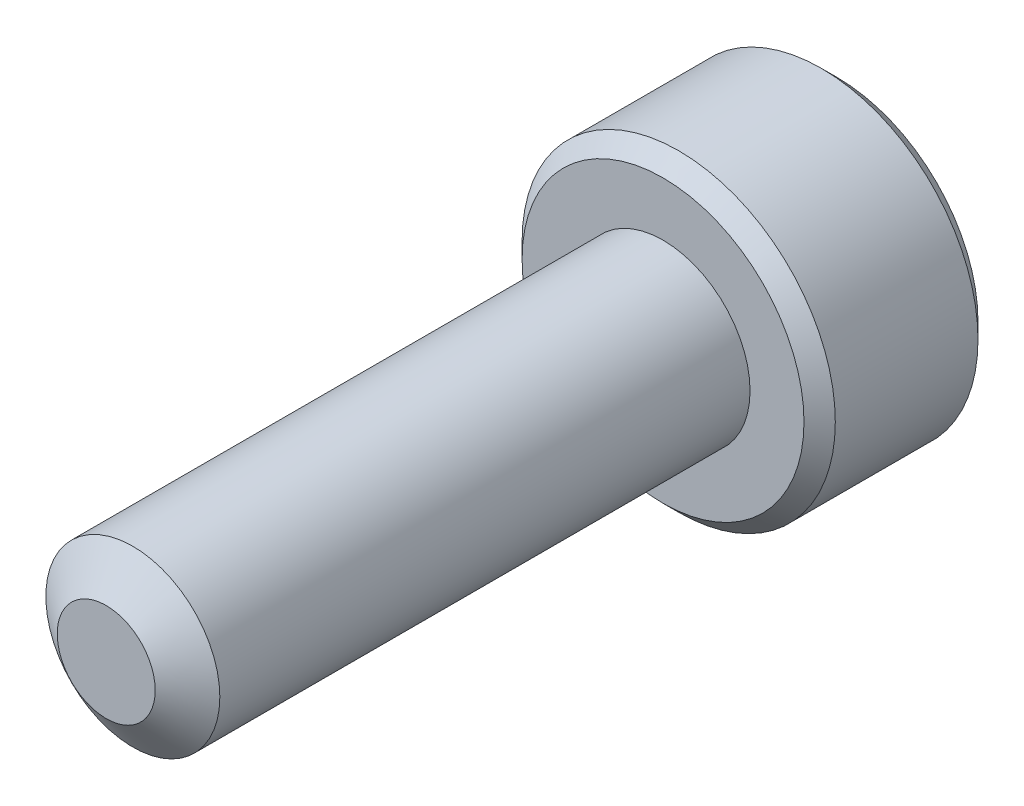
ISO-10303-21;
HEADER;
FILE_DESCRIPTION(('STEP AP214'),'2;1');
FILE_NAME('part.step','',(''),(''),'','','');
FILE_SCHEMA(('AUTOMOTIVE_DESIGN { 1 0 10303 214 1 1 1 1 }'));
ENDSEC;
DATA;
#1=APPLICATION_CONTEXT('core data for automotive mechanical design processes');
#2=APPLICATION_PROTOCOL_DEFINITION('international standard','automotive_design',2000,#1);
#3=PRODUCT_CONTEXT('',#1,'mechanical');
#4=PRODUCT('Part','Part','',(#3));
#5=PRODUCT_RELATED_PRODUCT_CATEGORY('part','',(#4));
#6=PRODUCT_DEFINITION_FORMATION('','',#4);
#7=PRODUCT_DEFINITION_CONTEXT('part definition',#1,'design');
#8=PRODUCT_DEFINITION('design','',#6,#7);
#9=PRODUCT_DEFINITION_SHAPE('','',#8);
#10=(LENGTH_UNIT() NAMED_UNIT(*) SI_UNIT(.MILLI.,.METRE.));
#11=(NAMED_UNIT(*) PLANE_ANGLE_UNIT() SI_UNIT($,.RADIAN.));
#12=(NAMED_UNIT(*) SI_UNIT($,.STERADIAN.) SOLID_ANGLE_UNIT());
#13=UNCERTAINTY_MEASURE_WITH_UNIT(LENGTH_MEASURE(1.E-05),#10,'distance_accuracy_value','');
#14=(GEOMETRIC_REPRESENTATION_CONTEXT(3) GLOBAL_UNCERTAINTY_ASSIGNED_CONTEXT((#13)) GLOBAL_UNIT_ASSIGNED_CONTEXT((#10,
#11,#12)) REPRESENTATION_CONTEXT('',''));
#15=CARTESIAN_POINT('',(0.,0.,0.));
#16=DIRECTION('',(0.,0.,1.));
#17=DIRECTION('',(1.,0.,0.));
#18=AXIS2_PLACEMENT_3D('',#15,#16,#17);
#19=CARTESIAN_POINT('',(0.,0.,-8.));
#20=DIRECTION('',(0.,0.,1.));
#21=DIRECTION('',(1.,0.,0.));
#22=AXIS2_PLACEMENT_3D('',#19,#20,#21);
#23=CYLINDRICAL_SURFACE('',#22,1.25);
#24=CARTESIAN_POINT('',(0.,0.,-8.));
#25=DIRECTION('',(0.,0.,-1.));
#26=DIRECTION('',(-1.,0.,0.));
#27=AXIS2_PLACEMENT_3D('',#24,#25,#26);
#28=CIRCLE('',#27,1.25);
#29=CARTESIAN_POINT('',(-1.25,0.,-8.));
#30=VERTEX_POINT('',#29);
#31=EDGE_CURVE('E213',#30,#30,#28,.F.);
#32=ORIENTED_EDGE('',*,*,#31,.T.);
#33=EDGE_LOOP('',(#32));
#34=FACE_BOUND('',#33,.T.);
#35=CARTESIAN_POINT('',(0.,0.,-0.382511876358969));
#36=DIRECTION('',(0.,0.,1.));
#37=DIRECTION('',(1.,0.,0.));
#38=AXIS2_PLACEMENT_3D('',#35,#36,#37);
#39=CIRCLE('',#38,1.25);
#40=CARTESIAN_POINT('',(1.25,0.,-0.382511876358969));
#41=VERTEX_POINT('',#40);
#42=EDGE_CURVE('E107',#41,#41,#39,.T.);
#43=ORIENTED_EDGE('',*,*,#42,.F.);
#44=EDGE_LOOP('',(#43));
#45=FACE_BOUND('',#44,.T.);
#46=ADVANCED_FACE('F33',(#34,#45),#23,.T.);
#47=CARTESIAN_POINT('',(0.,0.,0.));
#48=DIRECTION('',(0.,0.,-1.));
#49=DIRECTION('',(-1.,0.,0.));
#50=AXIS2_PLACEMENT_3D('',#47,#48,#49);
#51=CONICAL_SURFACE('',#50,0.703716426222746,0.959931088596886);
#52=ORIENTED_EDGE('',*,*,#42,.T.);
#53=EDGE_LOOP('',(#52));
#54=FACE_BOUND('',#53,.T.);
#55=CARTESIAN_POINT('',(0.,0.,0.));
#56=DIRECTION('',(0.,0.,1.));
#57=DIRECTION('',(1.,0.,0.));
#58=AXIS2_PLACEMENT_3D('',#55,#56,#57);
#59=CIRCLE('',#58,0.703716426222746);
#60=CARTESIAN_POINT('',(0.703716426222746,0.,0.));
#61=VERTEX_POINT('',#60);
#62=EDGE_CURVE('E211',#61,#61,#59,.T.);
#63=ORIENTED_EDGE('',*,*,#62,.F.);
#64=EDGE_LOOP('',(#63));
#65=FACE_BOUND('',#64,.T.);
#66=ADVANCED_FACE('F194',(#54,#65),#51,.T.);
#67=CARTESIAN_POINT('',(0.,0.,0.));
#68=DIRECTION('',(0.,0.,1.));
#69=DIRECTION('',(1.,0.,0.));
#70=AXIS2_PLACEMENT_3D('',#67,#68,#69);
#71=PLANE('',#70);
#72=ORIENTED_EDGE('',*,*,#62,.T.);
#73=EDGE_LOOP('',(#72));
#74=FACE_BOUND('',#73,.T.);
#75=ADVANCED_FACE('F191',(#74),#71,.T.);
#76=CARTESIAN_POINT('',(0.,0.,-10.5));
#77=DIRECTION('',(0.,0.,1.));
#78=DIRECTION('',(1.,0.,0.));
#79=AXIS2_PLACEMENT_3D('',#76,#77,#78);
#80=CYLINDRICAL_SURFACE('',#79,2.25);
#81=CARTESIAN_POINT('',(0.,0.,-10.275));
#82=DIRECTION('',(0.,0.,-1.));
#83=DIRECTION('',(-1.,0.,0.));
#84=AXIS2_PLACEMENT_3D('',#81,#82,#83);
#85=CIRCLE('',#84,2.25);
#86=CARTESIAN_POINT('',(-2.25,0.,-10.275));
#87=VERTEX_POINT('',#86);
#88=EDGE_CURVE('E41',#87,#87,#85,.F.);
#89=ORIENTED_EDGE('',*,*,#88,.T.);
#90=EDGE_LOOP('',(#89));
#91=FACE_BOUND('',#90,.T.);
#92=CARTESIAN_POINT('',(0.,0.,-8.225));
#93=DIRECTION('',(0.,0.,-1.));
#94=DIRECTION('',(-1.,0.,0.));
#95=AXIS2_PLACEMENT_3D('',#92,#93,#94);
#96=CIRCLE('',#95,2.25);
#97=CARTESIAN_POINT('',(-2.25,0.,-8.225));
#98=VERTEX_POINT('',#97);
#99=EDGE_CURVE('E170',#98,#98,#96,.T.);
#100=ORIENTED_EDGE('',*,*,#99,.T.);
#101=EDGE_LOOP('',(#100));
#102=FACE_BOUND('',#101,.T.);
#103=ADVANCED_FACE('F175',(#91,#102),#80,.T.);
#104=CARTESIAN_POINT('',(0.,0.,-10.5));
#105=DIRECTION('',(0.,0.,-1.));
#106=DIRECTION('',(-1.,0.,0.));
#107=AXIS2_PLACEMENT_3D('',#104,#105,#106);
#108=PLANE('',#107);
#109=CARTESIAN_POINT('',(0.,0.,-10.5));
#110=DIRECTION('',(0.,0.,-1.));
#111=DIRECTION('',(-1.,0.,0.));
#112=AXIS2_PLACEMENT_3D('',#109,#110,#111);
#113=CIRCLE('',#112,2.025);
#114=CARTESIAN_POINT('',(-2.025,0.,-10.5));
#115=VERTEX_POINT('',#114);
#116=EDGE_CURVE('E106',#115,#115,#113,.T.);
#117=ORIENTED_EDGE('',*,*,#116,.T.);
#118=EDGE_LOOP('',(#117));
#119=FACE_BOUND('',#118,.T.);
#120=CARTESIAN_POINT('',(0.,0.,-10.5));
#121=DIRECTION('',(0.,0.,-1.));
#122=DIRECTION('',(-1.,0.,0.));
#123=AXIS2_PLACEMENT_3D('',#120,#121,#122);
#124=CIRCLE('',#123,1.15470053837925);
#125=CARTESIAN_POINT('',(-0.999999999999994,0.577350269189638,-10.5));
#126=VERTEX_POINT('',#125);
#127=CARTESIAN_POINT('',(0.,1.15470053837925,-10.5));
#128=VERTEX_POINT('',#127);
#129=EDGE_CURVE('E87',#126,#128,#124,.T.);
#130=ORIENTED_EDGE('',*,*,#129,.F.);
#131=CARTESIAN_POINT('',(-0.999999999999994,-0.577350269189627,-10.5));
#132=VERTEX_POINT('',#131);
#133=EDGE_CURVE('E47',#132,#126,#124,.T.);
#134=ORIENTED_EDGE('',*,*,#133,.F.);
#135=CARTESIAN_POINT('',(0.,-1.15470053837925,-10.5));
#136=VERTEX_POINT('',#135);
#137=EDGE_CURVE('E272',#136,#132,#124,.T.);
#138=ORIENTED_EDGE('',*,*,#137,.F.);
#139=CARTESIAN_POINT('',(0.999999999999997,-0.577350269189633,-10.5));
#140=VERTEX_POINT('',#139);
#141=EDGE_CURVE('E54',#140,#136,#124,.T.);
#142=ORIENTED_EDGE('',*,*,#141,.F.);
#143=CARTESIAN_POINT('',(1.,0.577350269189627,-10.5));
#144=VERTEX_POINT('',#143);
#145=EDGE_CURVE('E128',#144,#140,#124,.T.);
#146=ORIENTED_EDGE('',*,*,#145,.F.);
#147=EDGE_CURVE('E96',#128,#144,#124,.T.);
#148=ORIENTED_EDGE('',*,*,#147,.F.);
#149=EDGE_LOOP('',(#130,#134,#138,#142,#146,#148));
#150=FACE_BOUND('',#149,.T.);
#151=ADVANCED_FACE('F127',(#119,#150),#108,.T.);
#152=CARTESIAN_POINT('',(0.,0.,-8.));
#153=DIRECTION('',(0.,0.,-1.));
#154=DIRECTION('',(-1.,0.,0.));
#155=AXIS2_PLACEMENT_3D('',#152,#153,#154);
#156=PLANE('',#155);
#157=CARTESIAN_POINT('',(0.,0.,-8.));
#158=DIRECTION('',(0.,0.,-1.));
#159=DIRECTION('',(-1.,0.,0.));
#160=AXIS2_PLACEMENT_3D('',#157,#158,#159);
#161=CIRCLE('',#160,2.025);
#162=CARTESIAN_POINT('',(-2.025,0.,-8.));
#163=VERTEX_POINT('',#162);
#164=EDGE_CURVE('E11',#163,#163,#161,.F.);
#165=ORIENTED_EDGE('',*,*,#164,.T.);
#166=EDGE_LOOP('',(#165));
#167=FACE_BOUND('',#166,.T.);
#168=ORIENTED_EDGE('',*,*,#31,.F.);
#169=EDGE_LOOP('',(#168));
#170=FACE_BOUND('',#169,.T.);
#171=ADVANCED_FACE('F184',(#167,#170),#156,.F.);
#172=CARTESIAN_POINT('',(0.,0.,-10.5));
#173=DIRECTION('',(0.,0.,-1.));
#174=DIRECTION('',(-1.,0.,0.));
#175=AXIS2_PLACEMENT_3D('',#172,#173,#174);
#176=CONICAL_SURFACE('',#175,1.15470053837925,0.78539816339745);
#177=ORIENTED_EDGE('',*,*,#147,.T.);
#178=CARTESIAN_POINT('',(-0.000200000000001025,1.15481600843309,-10.5001154873726));
#179=CARTESIAN_POINT('',(0.03418259500718,1.13496520795026,-10.4802779308257));
#180=CARTESIAN_POINT('',(0.0691401181398244,1.11478247255942,-10.4616050206389));
#181=CARTESIAN_POINT('',(0.140422802956089,1.07362739529219,-10.4274147427232));
#182=CARTESIAN_POINT('',(0.176754750528983,1.0526511355808,-10.4119164090235));
#183=CARTESIAN_POINT('',(0.25001661380331,1.01035337909803,-10.3853673071423));
#184=CARTESIAN_POINT('',(0.286927851445414,0.989042666109242,-10.3742497739969));
#185=CARTESIAN_POINT('',(0.361562729310859,0.945952199282692,-10.3571198657762));
#186=CARTESIAN_POINT('',(0.399284088108635,0.924173762626597,-10.3510946974667));
#187=CARTESIAN_POINT('',(0.464292198417933,0.886641312640016,-10.3456605549675));
#188=CARTESIAN_POINT('',(0.491494371528171,0.870936130672276,-10.3448569383167));
#189=CARTESIAN_POINT('',(0.545846040669112,0.839556179862849,-10.3462066994169));
#190=CARTESIAN_POINT('',(0.572995523754875,0.823881418494925,-10.3483607295472));
#191=CARTESIAN_POINT('',(0.65405627732696,0.777080970599368,-10.3591169721285));
#192=CARTESIAN_POINT('',(0.707564140978427,0.746188191116431,-10.3720145564154));
#193=CARTESIAN_POINT('',(0.801476065143431,0.691968116419651,-10.4031407306022));
#194=CARTESIAN_POINT('',(0.842320523671833,0.668386557293374,-10.4197377977018));
#195=CARTESIAN_POINT('',(0.922409637381941,0.622147085933684,-10.4571249246853));
#196=CARTESIAN_POINT('',(0.961659010870435,0.599486449584578,-10.4779013418174));
#197=CARTESIAN_POINT('',(1.0002,0.577234799135791,-10.5001154873726));
#198=B_SPLINE_CURVE_WITH_KNOTS('',3,(#178,#179,#180,#181,#182,#183,#184,#185,#186,#187,#188,
#189,#190,#191,#192,#193,#194,#195,#196,#197),.UNSPECIFIED.,.F.,.F.,(4,2,2,2,2,2,2,2,2,4),(0.,
0.13323767682856,0.26725222983449,0.3991370762693,0.530689603280768,0.624814864263846,
0.718960890149133,0.907306626112098,1.05710100361789,1.20641411519286),.UNSPECIFIED.);
#199=EDGE_CURVE('E101',#128,#144,#198,.T.);
#200=ORIENTED_EDGE('',*,*,#199,.F.);
#201=EDGE_LOOP('',(#177,#200));
#202=FACE_BOUND('',#201,.T.);
#203=ADVANCED_FACE('F102',(#202),#176,.F.);
#204=ORIENTED_EDGE('',*,*,#145,.T.);
#205=CARTESIAN_POINT('',(0.999999999999997,-1.15147208646461,-10.8703856775139));
#206=CARTESIAN_POINT('',(0.999999999999997,-1.12343447988552,-10.8492199198737));
#207=CARTESIAN_POINT('',(0.999999999999997,-1.09524064850697,-10.8282616921759));
#208=CARTESIAN_POINT('',(0.999999999999997,-1.03847715644376,-10.7868460222356));
#209=CARTESIAN_POINT('',(0.999999999999997,-1.00990740382975,-10.7663887061237));
#210=CARTESIAN_POINT('',(0.999999999999997,-0.923120894333475,-10.7056047949545));
#211=CARTESIAN_POINT('',(0.999999999999997,-0.864253173759058,-10.6661922289614));
#212=CARTESIAN_POINT('',(0.999999999999997,-0.740809858258044,-10.5888206642002));
#213=CARTESIAN_POINT('',(0.999999999999997,-0.676100255137806,-10.5510730391143));
#214=CARTESIAN_POINT('',(0.999999999999997,-0.543448939049123,-10.4820245875513));
#215=CARTESIAN_POINT('',(0.999999999999997,-0.475519112027778,-10.4507020278469));
#216=CARTESIAN_POINT('',(0.999999999999997,-0.373555850333528,-10.4123817788838));
#217=CARTESIAN_POINT('',(0.999999999999997,-0.341031989670907,-10.4013835916422));
#218=CARTESIAN_POINT('',(0.999999999999997,-0.275199079052293,-10.3819983421474));
#219=CARTESIAN_POINT('',(0.999999999999997,-0.241889975173933,-10.3736114597767));
#220=CARTESIAN_POINT('',(0.999999999999997,-0.175247517042993,-10.360025220719));
#221=CARTESIAN_POINT('',(0.999999999999997,-0.141925568218175,-10.354770790768));
#222=CARTESIAN_POINT('',(0.999999999999997,-0.0749144362322791,-10.3475486865709));
#223=CARTESIAN_POINT('',(0.999999999999997,-0.0412251978501621,-10.3455815136105));
#224=CARTESIAN_POINT('',(0.999999999999997,0.0249580992634205,-10.3450831983932));
#225=CARTESIAN_POINT('',(0.999999999999997,0.0574512826460387,-10.3464302678886));
#226=CARTESIAN_POINT('',(0.999999999999997,0.122148505701866,-10.352216484499));
#227=CARTESIAN_POINT('',(0.999999999999997,0.154352610132926,-10.3566549206615));
#228=CARTESIAN_POINT('',(0.999999999999997,0.218799898867639,-10.3684568301452));
#229=CARTESIAN_POINT('',(0.999999999999997,0.251033743268952,-10.3758705410385));
#230=CARTESIAN_POINT('',(0.999999999999997,0.314797132354918,-10.3932289424987));
#231=CARTESIAN_POINT('',(0.999999999999997,0.346326735731003,-10.4031734212888));
#232=CARTESIAN_POINT('',(0.999999999999997,0.445594187730203,-10.4382234825543));
#233=CARTESIAN_POINT('',(0.999999999999997,0.511919139476034,-10.4673208583567));
#234=CARTESIAN_POINT('',(0.999999999999997,0.64145324465753,-10.5320153296865));
#235=CARTESIAN_POINT('',(0.999999999999997,0.704650133126342,-10.5676357767152));
#236=CARTESIAN_POINT('',(0.999999999999997,0.825428490174984,-10.6411239013469));
#237=CARTESIAN_POINT('',(0.999999999999997,0.883132947867681,-10.6787919471355));
#238=CARTESIAN_POINT('',(0.999999999999997,0.968148853704561,-10.7370228529432));
#239=CARTESIAN_POINT('',(0.999999999999997,0.996120570380281,-10.7566384757629));
#240=CARTESIAN_POINT('',(0.999999999999997,1.05168177729901,-10.7963885170613));
#241=CARTESIAN_POINT('',(0.999999999999997,1.079271369977,-10.8165227921988));
#242=CARTESIAN_POINT('',(0.999999999999997,1.10670185346329,-10.836872119073));
#243=B_SPLINE_CURVE_WITH_KNOTS('',3,(#205,#206,#207,#208,#209,#210,#211,#212,#213,#214,#215,
#216,#217,#218,#219,#220,#221,#222,#223,#224,#225,#226,#227,#228,#229,#230,#231,#232,#233,#234,
#235,#236,#237,#238,#239,#240,#241,#242),.UNSPECIFIED.,.F.,.F.,(4,2,2,2,2,2,2,2,2,2,2,2,2,2,2,2,
2,2,4),(0.,0.10538645908329,0.210799187330123,0.423233611565467,0.647793540908501,
0.871580877738607,0.974493074181417,1.07741235827201,1.17846428203204,1.27953161415762,
1.3769408673961,1.47432772585407,1.57343322804293,1.67253043972851,1.88917353996827,
2.10660791038812,2.31323734249842,2.41572589232044,2.51818641476502),.UNSPECIFIED.);
#244=EDGE_CURVE('E95',#144,#140,#243,.F.);
#245=ORIENTED_EDGE('',*,*,#244,.F.);
#246=EDGE_LOOP('',(#204,#245));
#247=FACE_BOUND('',#246,.T.);
#248=ADVANCED_FACE('F278',(#247),#176,.F.);
#249=ORIENTED_EDGE('',*,*,#141,.T.);
#250=CARTESIAN_POINT('',(1.0002,-0.577234799135786,-10.5001154873726));
#251=CARTESIAN_POINT('',(0.965817404992817,-0.59708559961862,-10.4802779308257));
#252=CARTESIAN_POINT('',(0.930859881860172,-0.617268335009454,-10.4616050206389));
#253=CARTESIAN_POINT('',(0.859577197043908,-0.658423412276684,-10.4274147427232));
#254=CARTESIAN_POINT('',(0.823245249471014,-0.679399671988078,-10.4119164090235));
#255=CARTESIAN_POINT('',(0.749983386196687,-0.721697428470844,-10.3853673071423));
#256=CARTESIAN_POINT('',(0.713072148554584,-0.743008141459634,-10.3742497739969));
#257=CARTESIAN_POINT('',(0.638437270689139,-0.786098608286184,-10.3571198657762));
#258=CARTESIAN_POINT('',(0.600715911891363,-0.807877044942279,-10.3510946974667));
#259=CARTESIAN_POINT('',(0.535707801582065,-0.84540949492886,-10.3456605549675));
#260=CARTESIAN_POINT('',(0.508505628471827,-0.861114676896599,-10.3448569383167));
#261=CARTESIAN_POINT('',(0.454153959330887,-0.892494627706026,-10.3462066994169));
#262=CARTESIAN_POINT('',(0.427004476245123,-0.908169389073951,-10.3483607295472));
#263=CARTESIAN_POINT('',(0.345943722673039,-0.954969836969508,-10.3591169721285));
#264=CARTESIAN_POINT('',(0.292435859021572,-0.985862616452445,-10.3720145564154));
#265=CARTESIAN_POINT('',(0.198523934856569,-1.04008269114923,-10.4031407306022));
#266=CARTESIAN_POINT('',(0.157679476328166,-1.0636642502755,-10.4197377977018));
#267=CARTESIAN_POINT('',(0.0775903626180567,-1.10990372163519,-10.4571249246853));
#268=CARTESIAN_POINT('',(0.0383409891295626,-1.1325643579843,-10.4779013418174));
#269=CARTESIAN_POINT('',(-0.00019999999999984,-1.15481600843309,-10.5001154873726));
#270=B_SPLINE_CURVE_WITH_KNOTS('',3,(#250,#251,#252,#253,#254,#255,#256,#257,#258,#259,#260,
#261,#262,#263,#264,#265,#266,#267,#268,#269),.UNSPECIFIED.,.F.,.F.,(4,2,2,2,2,2,2,2,2,4),(0.,
0.133237676828559,0.267252229834489,0.399137076269299,0.530689603280767,0.624814864263844,
0.718960890149131,0.907306626112095,1.05710100361789,1.20641411519286),.UNSPECIFIED.);
#271=EDGE_CURVE('E138',#140,#136,#270,.T.);
#272=ORIENTED_EDGE('',*,*,#271,.F.);
#273=EDGE_LOOP('',(#249,#272));
#274=FACE_BOUND('',#273,.T.);
#275=ADVANCED_FACE('F275',(#274),#176,.F.);
#276=ORIENTED_EDGE('',*,*,#137,.T.);
#277=CARTESIAN_POINT('',(0.000199999999999672,-1.15481600843309,-10.5001154873726));
#278=CARTESIAN_POINT('',(-0.0341825950071813,-1.13496520795025,-10.4802779308257));
#279=CARTESIAN_POINT('',(-0.0691401181398256,-1.11478247255942,-10.4616050206389));
#280=CARTESIAN_POINT('',(-0.14042280295609,-1.07362739529219,-10.4274147427232));
#281=CARTESIAN_POINT('',(-0.176754750528984,-1.0526511355808,-10.4119164090235));
#282=CARTESIAN_POINT('',(-0.250016613803311,-1.01035337909803,-10.3853673071423));
#283=CARTESIAN_POINT('',(-0.286927851445414,-0.989042666109238,-10.3742497739969));
#284=CARTESIAN_POINT('',(-0.361562729310859,-0.945952199282689,-10.3571198657762));
#285=CARTESIAN_POINT('',(-0.399284088108635,-0.924173762626594,-10.3510946974667));
#286=CARTESIAN_POINT('',(-0.464292198417933,-0.886641312640013,-10.3456605549675));
#287=CARTESIAN_POINT('',(-0.491494371528171,-0.870936130672274,-10.3448569383167));
#288=CARTESIAN_POINT('',(-0.545846040669111,-0.839556179862846,-10.3462066994169));
#289=CARTESIAN_POINT('',(-0.572995523754874,-0.823881418494922,-10.3483607295472));
#290=CARTESIAN_POINT('',(-0.654056277326959,-0.777080970599365,-10.3591169721285));
#291=CARTESIAN_POINT('',(-0.707564140978426,-0.746188191116429,-10.3720145564154));
#292=CARTESIAN_POINT('',(-0.801476065143429,-0.691968116419649,-10.4031407306022));
#293=CARTESIAN_POINT('',(-0.842320523671831,-0.668386557293371,-10.4197377977018));
#294=CARTESIAN_POINT('',(-0.922409637381938,-0.622147085933682,-10.4571249246853));
#295=CARTESIAN_POINT('',(-0.961659010870432,-0.599486449584576,-10.4779013418174));
#296=CARTESIAN_POINT('',(-1.00019999999999,-0.577234799135789,-10.5001154873726));
#297=B_SPLINE_CURVE_WITH_KNOTS('',3,(#277,#278,#279,#280,#281,#282,#283,#284,#285,#286,#287,
#288,#289,#290,#291,#292,#293,#294,#295,#296),.UNSPECIFIED.,.F.,.F.,(4,2,2,2,2,2,2,2,2,4),(0.,
0.133237676828559,0.267252229834489,0.399137076269299,0.530689603280767,0.624814864263844,
0.718960890149131,0.907306626112095,1.05710100361789,1.20641411519285),.UNSPECIFIED.);
#298=EDGE_CURVE('E249',#136,#132,#297,.T.);
#299=ORIENTED_EDGE('',*,*,#298,.F.);
#300=EDGE_LOOP('',(#276,#299));
#301=FACE_BOUND('',#300,.T.);
#302=ADVANCED_FACE('F274',(#301),#176,.F.);
#303=ORIENTED_EDGE('',*,*,#133,.T.);
#304=CARTESIAN_POINT('',(-0.999999999999994,-1.15147208646462,-10.8703856775139));
#305=CARTESIAN_POINT('',(-0.999999999999994,-1.12343447988552,-10.8492199198737));
#306=CARTESIAN_POINT('',(-0.999999999999994,-1.09524064850698,-10.8282616921759));
#307=CARTESIAN_POINT('',(-0.999999999999994,-1.03847715644377,-10.7868460222356));
#308=CARTESIAN_POINT('',(-0.999999999999994,-1.00990740382975,-10.7663887061237));
#309=CARTESIAN_POINT('',(-0.999999999999994,-0.923120894333481,-10.7056047949545));
#310=CARTESIAN_POINT('',(-0.999999999999994,-0.864253173759064,-10.6661922289614));
#311=CARTESIAN_POINT('',(-0.999999999999994,-0.74080985825805,-10.5888206642002));
#312=CARTESIAN_POINT('',(-0.999999999999994,-0.676100255137811,-10.5510730391143));
#313=CARTESIAN_POINT('',(-0.999999999999994,-0.543448939049128,-10.4820245875513));
#314=CARTESIAN_POINT('',(-0.999999999999994,-0.475519112027782,-10.4507020278469));
#315=CARTESIAN_POINT('',(-0.999999999999994,-0.373555850333532,-10.4123817788838));
#316=CARTESIAN_POINT('',(-0.999999999999994,-0.341031989670911,-10.4013835916422));
#317=CARTESIAN_POINT('',(-0.999999999999994,-0.275199079052297,-10.3819983421474));
#318=CARTESIAN_POINT('',(-0.999999999999994,-0.241889975173936,-10.3736114597767));
#319=CARTESIAN_POINT('',(-0.999999999999994,-0.175247517042995,-10.360025220719));
#320=CARTESIAN_POINT('',(-0.999999999999994,-0.141925568218178,-10.354770790768));
#321=CARTESIAN_POINT('',(-0.999999999999994,-0.0749144362322814,-10.3475486865709));
#322=CARTESIAN_POINT('',(-0.999999999999994,-0.0412251978501641,-10.3455815136105));
#323=CARTESIAN_POINT('',(-0.999999999999994,0.0249580992634187,-10.3450831983932));
#324=CARTESIAN_POINT('',(-0.999999999999994,0.0574512826460369,-10.3464302678886));
#325=CARTESIAN_POINT('',(-0.999999999999994,0.122148505701864,-10.352216484499));
#326=CARTESIAN_POINT('',(-0.999999999999994,0.154352610132924,-10.3566549206615));
#327=CARTESIAN_POINT('',(-0.999999999999994,0.218799898867637,-10.3684568301452));
#328=CARTESIAN_POINT('',(-0.999999999999994,0.251033743268951,-10.3758705410385));
#329=CARTESIAN_POINT('',(-0.999999999999994,0.314797132354916,-10.3932289424987));
#330=CARTESIAN_POINT('',(-0.999999999999994,0.346326735731002,-10.4031734212888));
#331=CARTESIAN_POINT('',(-0.999999999999994,0.445594187730202,-10.4382234825543));
#332=CARTESIAN_POINT('',(-0.999999999999994,0.511919139476034,-10.4673208583567));
#333=CARTESIAN_POINT('',(-0.999999999999994,0.641453244657529,-10.5320153296865));
#334=CARTESIAN_POINT('',(-0.999999999999994,0.70465013312634,-10.5676357767152));
#335=CARTESIAN_POINT('',(-0.999999999999994,0.825428490174982,-10.6411239013469));
#336=CARTESIAN_POINT('',(-0.999999999999994,0.883132947867679,-10.6787919471355));
#337=CARTESIAN_POINT('',(-0.999999999999994,0.968148853704559,-10.7370228529432));
#338=CARTESIAN_POINT('',(-0.999999999999994,0.996120570380279,-10.7566384757628));
#339=CARTESIAN_POINT('',(-0.999999999999994,1.05168177729901,-10.7963885170613));
#340=CARTESIAN_POINT('',(-0.999999999999994,1.079271369977,-10.8165227921988));
#341=CARTESIAN_POINT('',(-0.999999999999994,1.10670185346329,-10.836872119073));
#342=B_SPLINE_CURVE_WITH_KNOTS('',3,(#304,#305,#306,#307,#308,#309,#310,#311,#312,#313,#314,
#315,#316,#317,#318,#319,#320,#321,#322,#323,#324,#325,#326,#327,#328,#329,#330,#331,#332,#333,
#334,#335,#336,#337,#338,#339,#340,#341),.UNSPECIFIED.,.F.,.F.,(4,2,2,2,2,2,2,2,2,2,2,2,2,2,2,2,
2,2,4),(0.,0.10538645908329,0.210799187330124,0.423233611565468,0.647793540908503,
0.871580877738611,0.974493074181422,1.07741235827201,1.17846428203205,1.27953161415762,
1.37694086739611,1.47432772585408,1.57343322804293,1.67253043972852,1.88917353996827,
2.10660791038813,2.31323734249843,2.41572589232044,2.51818641476503),.UNSPECIFIED.);
#343=EDGE_CURVE('E117',#132,#126,#342,.T.);
#344=ORIENTED_EDGE('',*,*,#343,.F.);
#345=EDGE_LOOP('',(#303,#344));
#346=FACE_BOUND('',#345,.T.);
#347=ADVANCED_FACE('F287',(#346),#176,.F.);
#348=ORIENTED_EDGE('',*,*,#129,.T.);
#349=CARTESIAN_POINT('',(-1.00019999999999,0.577234799135794,-10.5001154873726));
#350=CARTESIAN_POINT('',(-0.965817404992813,0.597085599618627,-10.4802779308257));
#351=CARTESIAN_POINT('',(-0.93085988186017,0.617268335009462,-10.4616050206389));
#352=CARTESIAN_POINT('',(-0.859577197043906,0.658423412276691,-10.4274147427232));
#353=CARTESIAN_POINT('',(-0.823245249471012,0.679399671988084,-10.4119164090235));
#354=CARTESIAN_POINT('',(-0.749983386196686,0.72169742847085,-10.3853673071423));
#355=CARTESIAN_POINT('',(-0.713072148554583,0.74300814145964,-10.3742497739969));
#356=CARTESIAN_POINT('',(-0.638437270689139,0.786098608286189,-10.3571198657762));
#357=CARTESIAN_POINT('',(-0.600715911891363,0.807877044942284,-10.3510946974667));
#358=CARTESIAN_POINT('',(-0.535707801582065,0.845409494928865,-10.3456605549675));
#359=CARTESIAN_POINT('',(-0.508505628471827,0.861114676896604,-10.3448569383167));
#360=CARTESIAN_POINT('',(-0.454153959330887,0.892494627706032,-10.3462066994169));
#361=CARTESIAN_POINT('',(-0.427004476245123,0.908169389073956,-10.3483607295472));
#362=CARTESIAN_POINT('',(-0.345943722673038,0.954969836969513,-10.3591169721285));
#363=CARTESIAN_POINT('',(-0.292435859021571,0.98586261645245,-10.3720145564154));
#364=CARTESIAN_POINT('',(-0.198523934856568,1.04008269114923,-10.4031407306022));
#365=CARTESIAN_POINT('',(-0.157679476328166,1.06366425027551,-10.4197377977018));
#366=CARTESIAN_POINT('',(-0.0775903626180574,1.1099037216352,-10.4571249246853));
#367=CARTESIAN_POINT('',(-0.0383409891295638,1.1325643579843,-10.4779013418174));
#368=CARTESIAN_POINT('',(0.000199999999998055,1.15481600843309,-10.5001154873726));
#369=B_SPLINE_CURVE_WITH_KNOTS('',3,(#349,#350,#351,#352,#353,#354,#355,#356,#357,#358,#359,
#360,#361,#362,#363,#364,#365,#366,#367,#368),.UNSPECIFIED.,.F.,.F.,(4,2,2,2,2,2,2,2,2,4),(0.,
0.133237676828557,0.267252229834486,0.399137076269294,0.530689603280761,0.624814864263839,
0.718960890149126,0.90730662611209,1.05710100361788,1.20641411519285),.UNSPECIFIED.);
#370=EDGE_CURVE('E91',#126,#128,#369,.T.);
#371=ORIENTED_EDGE('',*,*,#370,.F.);
#372=EDGE_LOOP('',(#348,#371));
#373=FACE_BOUND('',#372,.T.);
#374=ADVANCED_FACE('F89',(#373),#176,.F.);
#375=CARTESIAN_POINT('',(0.999999999999997,1.73205080756888,-9.));
#376=DIRECTION('',(0.,0.,-1.));
#377=DIRECTION('',(-1.,0.,0.));
#378=AXIS2_PLACEMENT_3D('',#375,#376,#377);
#379=PLANE('',#378);
#380=DIRECTION('',(0.866025403784439,0.5,0.));
#381=VECTOR('',#380,1.);
#382=CARTESIAN_POINT('',(-0.999999999999994,0.577350269189631,-9.));
#383=LINE('',#382,#381);
#384=CARTESIAN_POINT('',(-0.999999999999994,0.577350269189631,-9.));
#385=VERTEX_POINT('',#384);
#386=CARTESIAN_POINT('',(0.,1.15470053837925,-9.));
#387=VERTEX_POINT('',#386);
#388=EDGE_CURVE('E116',#385,#387,#383,.T.);
#389=ORIENTED_EDGE('',*,*,#388,.T.);
#390=DIRECTION('',(0.866025403784439,-0.499999999999999,0.));
#391=VECTOR('',#390,1.);
#392=CARTESIAN_POINT('',(0.,1.15470053837925,-9.));
#393=LINE('',#392,#391);
#394=CARTESIAN_POINT('',(0.999999999999997,0.577350269189629,-9.));
#395=VERTEX_POINT('',#394);
#396=EDGE_CURVE('E121',#387,#395,#393,.T.);
#397=ORIENTED_EDGE('',*,*,#396,.T.);
#398=DIRECTION('',(0.,-1.,0.));
#399=VECTOR('',#398,1.);
#400=CARTESIAN_POINT('',(0.999999999999997,0.577350269189629,-9.));
#401=LINE('',#400,#399);
#402=CARTESIAN_POINT('',(0.999999999999997,-0.577350269189624,-9.));
#403=VERTEX_POINT('',#402);
#404=EDGE_CURVE('E235',#395,#403,#401,.T.);
#405=ORIENTED_EDGE('',*,*,#404,.T.);
#406=DIRECTION('',(-0.866025403784438,-0.500000000000001,0.));
#407=VECTOR('',#406,1.);
#408=CARTESIAN_POINT('',(0.999999999999997,-0.577350269189624,-9.));
#409=LINE('',#408,#407);
#410=CARTESIAN_POINT('',(0.,-1.15470053837925,-9.));
#411=VERTEX_POINT('',#410);
#412=EDGE_CURVE('E232',#403,#411,#409,.T.);
#413=ORIENTED_EDGE('',*,*,#412,.T.);
#414=DIRECTION('',(-0.866025403784439,0.5,0.));
#415=VECTOR('',#414,1.);
#416=CARTESIAN_POINT('',(0.,-1.15470053837925,-9.));
#417=LINE('',#416,#415);
#418=CARTESIAN_POINT('',(-0.999999999999994,-0.577350269189627,-9.));
#419=VERTEX_POINT('',#418);
#420=EDGE_CURVE('E229',#411,#419,#417,.T.);
#421=ORIENTED_EDGE('',*,*,#420,.T.);
#422=DIRECTION('',(0.,1.,0.));
#423=VECTOR('',#422,1.);
#424=CARTESIAN_POINT('',(-0.999999999999994,-0.577350269189627,-9.));
#425=LINE('',#424,#423);
#426=EDGE_CURVE('E124',#419,#385,#425,.T.);
#427=ORIENTED_EDGE('',*,*,#426,.T.);
#428=EDGE_LOOP('',(#389,#397,#405,#413,#421,#427));
#429=FACE_BOUND('',#428,.T.);
#430=ADVANCED_FACE('F158',(#429),#379,.T.);
#431=CARTESIAN_POINT('',(0.,1.15470053837925,-9.));
#432=DIRECTION('',(0.499999999999999,0.866025403784439,0.));
#433=DIRECTION('',(-0.866025403784439,0.499999999999999,0.));
#434=AXIS2_PLACEMENT_3D('',#431,#432,#433);
#435=PLANE('',#434);
#436=DIRECTION('',(0.,0.,-1.));
#437=VECTOR('',#436,1.);
#438=CARTESIAN_POINT('',(0.,1.15470053837925,-9.));
#439=LINE('',#438,#437);
#440=EDGE_CURVE('E113',#387,#128,#439,.T.);
#441=ORIENTED_EDGE('',*,*,#440,.T.);
#442=ORIENTED_EDGE('',*,*,#199,.T.);
#443=DIRECTION('',(0.,0.,-1.));
#444=VECTOR('',#443,1.);
#445=CARTESIAN_POINT('',(0.999999999999997,0.577350269189629,-9.));
#446=LINE('',#445,#444);
#447=EDGE_CURVE('E123',#395,#144,#446,.T.);
#448=ORIENTED_EDGE('',*,*,#447,.F.);
#449=ORIENTED_EDGE('',*,*,#396,.F.);
#450=EDGE_LOOP('',(#441,#442,#448,#449));
#451=FACE_BOUND('',#450,.T.);
#452=ADVANCED_FACE('F119',(#451),#435,.F.);
#453=CARTESIAN_POINT('',(0.999999999999997,0.577350269189629,-9.));
#454=DIRECTION('',(1.,0.,0.));
#455=DIRECTION('',(0.,0.,-1.));
#456=AXIS2_PLACEMENT_3D('',#453,#454,#455);
#457=PLANE('',#456);
#458=ORIENTED_EDGE('',*,*,#447,.T.);
#459=ORIENTED_EDGE('',*,*,#244,.T.);
#460=DIRECTION('',(0.,0.,-1.));
#461=VECTOR('',#460,1.);
#462=CARTESIAN_POINT('',(0.999999999999997,-0.577350269189624,-9.));
#463=LINE('',#462,#461);
#464=EDGE_CURVE('E218',#403,#140,#463,.T.);
#465=ORIENTED_EDGE('',*,*,#464,.F.);
#466=ORIENTED_EDGE('',*,*,#404,.F.);
#467=EDGE_LOOP('',(#458,#459,#465,#466));
#468=FACE_BOUND('',#467,.T.);
#469=ADVANCED_FACE('F147',(#468),#457,.F.);
#470=CARTESIAN_POINT('',(0.999999999999997,-0.577350269189624,-9.));
#471=DIRECTION('',(0.500000000000001,-0.866025403784438,0.));
#472=DIRECTION('',(0.866025403784438,0.500000000000001,0.));
#473=AXIS2_PLACEMENT_3D('',#470,#471,#472);
#474=PLANE('',#473);
#475=ORIENTED_EDGE('',*,*,#464,.T.);
#476=ORIENTED_EDGE('',*,*,#271,.T.);
#477=DIRECTION('',(0.,0.,-1.));
#478=VECTOR('',#477,1.);
#479=CARTESIAN_POINT('',(0.,-1.15470053837925,-9.));
#480=LINE('',#479,#478);
#481=EDGE_CURVE('E221',#411,#136,#480,.T.);
#482=ORIENTED_EDGE('',*,*,#481,.F.);
#483=ORIENTED_EDGE('',*,*,#412,.F.);
#484=EDGE_LOOP('',(#475,#476,#482,#483));
#485=FACE_BOUND('',#484,.T.);
#486=ADVANCED_FACE('F151',(#485),#474,.F.);
#487=CARTESIAN_POINT('',(0.,-1.15470053837925,-9.));
#488=DIRECTION('',(-0.5,-0.866025403784439,0.));
#489=DIRECTION('',(0.866025403784439,-0.5,0.));
#490=AXIS2_PLACEMENT_3D('',#487,#488,#489);
#491=PLANE('',#490);
#492=ORIENTED_EDGE('',*,*,#481,.T.);
#493=ORIENTED_EDGE('',*,*,#298,.T.);
#494=DIRECTION('',(0.,0.,-1.));
#495=VECTOR('',#494,1.);
#496=CARTESIAN_POINT('',(-0.999999999999994,-0.577350269189627,-9.));
#497=LINE('',#496,#495);
#498=EDGE_CURVE('E224',#419,#132,#497,.T.);
#499=ORIENTED_EDGE('',*,*,#498,.F.);
#500=ORIENTED_EDGE('',*,*,#420,.F.);
#501=EDGE_LOOP('',(#492,#493,#499,#500));
#502=FACE_BOUND('',#501,.T.);
#503=ADVANCED_FACE('F257',(#502),#491,.F.);
#504=CARTESIAN_POINT('',(-0.999999999999994,-0.577350269189627,-9.));
#505=DIRECTION('',(-1.,0.,0.));
#506=DIRECTION('',(0.,0.,1.));
#507=AXIS2_PLACEMENT_3D('',#504,#505,#506);
#508=PLANE('',#507);
#509=ORIENTED_EDGE('',*,*,#498,.T.);
#510=ORIENTED_EDGE('',*,*,#343,.T.);
#511=DIRECTION('',(0.,0.,-1.));
#512=VECTOR('',#511,1.);
#513=CARTESIAN_POINT('',(-0.999999999999994,0.577350269189631,-9.));
#514=LINE('',#513,#512);
#515=EDGE_CURVE('E115',#385,#126,#514,.T.);
#516=ORIENTED_EDGE('',*,*,#515,.F.);
#517=ORIENTED_EDGE('',*,*,#426,.F.);
#518=EDGE_LOOP('',(#509,#510,#516,#517));
#519=FACE_BOUND('',#518,.T.);
#520=ADVANCED_FACE('F254',(#519),#508,.F.);
#521=CARTESIAN_POINT('',(-0.999999999999994,0.577350269189631,-9.));
#522=DIRECTION('',(-0.5,0.866025403784439,0.));
#523=DIRECTION('',(-0.866025403784439,-0.5,0.));
#524=AXIS2_PLACEMENT_3D('',#521,#522,#523);
#525=PLANE('',#524);
#526=ORIENTED_EDGE('',*,*,#515,.T.);
#527=ORIENTED_EDGE('',*,*,#370,.T.);
#528=ORIENTED_EDGE('',*,*,#440,.F.);
#529=ORIENTED_EDGE('',*,*,#388,.F.);
#530=EDGE_LOOP('',(#526,#527,#528,#529));
#531=FACE_BOUND('',#530,.T.);
#532=ADVANCED_FACE('F111',(#531),#525,.F.);
#533=CARTESIAN_POINT('',(0.,0.,-10.5));
#534=DIRECTION('',(0.,0.,1.));
#535=DIRECTION('',(1.,0.,0.));
#536=AXIS2_PLACEMENT_3D('',#533,#534,#535);
#537=CONICAL_SURFACE('',#536,2.025,0.785398163397448);
#538=ORIENTED_EDGE('',*,*,#88,.F.);
#539=EDGE_LOOP('',(#538));
#540=FACE_BOUND('',#539,.T.);
#541=ORIENTED_EDGE('',*,*,#116,.F.);
#542=EDGE_LOOP('',(#541));
#543=FACE_BOUND('',#542,.T.);
#544=ADVANCED_FACE('F178',(#540,#543),#537,.T.);
#545=CARTESIAN_POINT('',(0.,0.,-8.225));
#546=DIRECTION('',(0.,0.,-1.));
#547=DIRECTION('',(-1.,0.,0.));
#548=AXIS2_PLACEMENT_3D('',#545,#546,#547);
#549=CONICAL_SURFACE('',#548,2.25,0.785398163397443);
#550=CARTESIAN_POINT('',(-2.025,0.,-8.));
#551=CARTESIAN_POINT('',(-2.02734375,0.,-8.00234375));
#552=CARTESIAN_POINT('',(-2.0296875,0.,-8.0046875));
#553=CARTESIAN_POINT('',(-2.034375,0.,-8.009375));
#554=CARTESIAN_POINT('',(-2.03671875,0.,-8.01171875));
#555=CARTESIAN_POINT('',(-2.04140625,0.,-8.01640625));
#556=CARTESIAN_POINT('',(-2.04375,0.,-8.01875));
#557=CARTESIAN_POINT('',(-2.0484375,0.,-8.0234375));
#558=CARTESIAN_POINT('',(-2.05078125,0.,-8.02578125));
#559=CARTESIAN_POINT('',(-2.05546875,0.,-8.03046875));
#560=CARTESIAN_POINT('',(-2.0578125,0.,-8.0328125));
#561=CARTESIAN_POINT('',(-2.0625,0.,-8.0375));
#562=CARTESIAN_POINT('',(-2.06484375,0.,-8.03984375));
#563=CARTESIAN_POINT('',(-2.06953125,0.,-8.04453125));
#564=CARTESIAN_POINT('',(-2.071875,0.,-8.046875));
#565=CARTESIAN_POINT('',(-2.0765625,0.,-8.0515625));
#566=CARTESIAN_POINT('',(-2.07890625,0.,-8.05390625));
#567=CARTESIAN_POINT('',(-2.08359375,0.,-8.05859375));
#568=CARTESIAN_POINT('',(-2.0859375,0.,-8.0609375));
#569=CARTESIAN_POINT('',(-2.090625,0.,-8.065625));
#570=CARTESIAN_POINT('',(-2.09296875,0.,-8.06796875));
#571=CARTESIAN_POINT('',(-2.09765625,0.,-8.07265625));
#572=CARTESIAN_POINT('',(-2.1,0.,-8.075));
#573=CARTESIAN_POINT('',(-2.1046875,0.,-8.0796875));
#574=CARTESIAN_POINT('',(-2.10703125,0.,-8.08203125));
#575=CARTESIAN_POINT('',(-2.11171875,0.,-8.08671875));
#576=CARTESIAN_POINT('',(-2.1140625,0.,-8.0890625));
#577=CARTESIAN_POINT('',(-2.11875,0.,-8.09375));
#578=CARTESIAN_POINT('',(-2.12109375,0.,-8.09609375));
#579=CARTESIAN_POINT('',(-2.12578125,0.,-8.10078125));
#580=CARTESIAN_POINT('',(-2.128125,0.,-8.103125));
#581=CARTESIAN_POINT('',(-2.1328125,0.,-8.1078125));
#582=CARTESIAN_POINT('',(-2.13515625,0.,-8.11015625));
#583=CARTESIAN_POINT('',(-2.13984375,0.,-8.11484375));
#584=CARTESIAN_POINT('',(-2.1421875,0.,-8.1171875));
#585=CARTESIAN_POINT('',(-2.146875,0.,-8.121875));
#586=CARTESIAN_POINT('',(-2.14921875,0.,-8.12421875));
#587=CARTESIAN_POINT('',(-2.15390625,0.,-8.12890625));
#588=CARTESIAN_POINT('',(-2.15625,0.,-8.13125));
#589=CARTESIAN_POINT('',(-2.1609375,0.,-8.1359375));
#590=CARTESIAN_POINT('',(-2.16328125,0.,-8.13828125));
#591=CARTESIAN_POINT('',(-2.16796875,0.,-8.14296875));
#592=CARTESIAN_POINT('',(-2.1703125,0.,-8.1453125));
#593=CARTESIAN_POINT('',(-2.175,0.,-8.15));
#594=CARTESIAN_POINT('',(-2.17734375,0.,-8.15234375));
#595=CARTESIAN_POINT('',(-2.18203125,0.,-8.15703125));
#596=CARTESIAN_POINT('',(-2.184375,0.,-8.159375));
#597=CARTESIAN_POINT('',(-2.1890625,0.,-8.1640625));
#598=CARTESIAN_POINT('',(-2.19140625,0.,-8.16640625));
#599=CARTESIAN_POINT('',(-2.19609375,0.,-8.17109375));
#600=CARTESIAN_POINT('',(-2.1984375,0.,-8.1734375));
#601=CARTESIAN_POINT('',(-2.203125,0.,-8.178125));
#602=CARTESIAN_POINT('',(-2.20546875,0.,-8.18046875));
#603=CARTESIAN_POINT('',(-2.21015625,0.,-8.18515625));
#604=CARTESIAN_POINT('',(-2.2125,0.,-8.1875));
#605=CARTESIAN_POINT('',(-2.2171875,0.,-8.1921875));
#606=CARTESIAN_POINT('',(-2.21953125,0.,-8.19453125));
#607=CARTESIAN_POINT('',(-2.22421875,0.,-8.19921875));
#608=CARTESIAN_POINT('',(-2.2265625,0.,-8.2015625));
#609=CARTESIAN_POINT('',(-2.23125,0.,-8.20625));
#610=CARTESIAN_POINT('',(-2.23359375,0.,-8.20859375));
#611=CARTESIAN_POINT('',(-2.23828125,0.,-8.21328125));
#612=CARTESIAN_POINT('',(-2.240625,0.,-8.215625));
#613=CARTESIAN_POINT('',(-2.2453125,0.,-8.2203125));
#614=CARTESIAN_POINT('',(-2.24765625,0.,-8.22265625));
#615=CARTESIAN_POINT('',(-2.25,0.,-8.225));
#616=B_SPLINE_CURVE_WITH_KNOTS('',3,(#550,#551,#552,#553,#554,#555,#556,#557,#558,#559,#560,
#561,#562,#563,#564,#565,#566,#567,#568,#569,#570,#571,#572,#573,#574,#575,#576,#577,#578,#579,
#580,#581,#582,#583,#584,#585,#586,#587,#588,#589,#590,#591,#592,#593,#594,#595,#596,#597,#598,
#599,#600,#601,#602,#603,#604,#605,#606,#607,#608,#609,#610,#611,#612,#613,#614,#615),
.UNSPECIFIED.,.F.,.F.,(4,2,2,2,2,2,2,2,2,2,2,2,2,2,2,2,2,2,2,2,2,2,2,2,2,2,2,2,2,2,2,2,4),(0.,
0.00994368911043657,0.0198873782208719,0.0298310673313082,0.0397747564417435,0.0497184455521801,
0.0596621346626154,0.069605823773052,0.0795495128834871,0.0894932019939236,0.099436891104359,
0.109380580214796,0.119324269325232,0.129267958435667,0.139211647546102,0.149155336656539,
0.159099025766974,0.169042714877411,0.178986403987846,0.188930093098283,0.198873782208718,
0.208817471319154,0.21876116042959,0.228704849540026,0.238648538650463,0.248592227760898,
0.258535916871335,0.26847960598177,0.278423295092206,0.288366984202642,0.298310673313078,
0.308254362423513,0.31819805153395),.UNSPECIFIED.);
#617=EDGE_CURVE('BSEAM35',#163,#98,#616,.T.);
#618=ORIENTED_EDGE('',*,*,#164,.F.);
#619=ORIENTED_EDGE('',*,*,#99,.F.);
#620=ORIENTED_EDGE('',*,*,#617,.T.);
#621=ORIENTED_EDGE('',*,*,#617,.F.);
#622=EDGE_LOOP('',(#618,#620,#619,#621));
#623=FACE_BOUND('',#622,.T.);
#624=ADVANCED_FACE('F35',(#623),#549,.T.);
#625=CLOSED_SHELL('',(#46,#66,#75,#103,#151,#171,#203,#248,#275,#302,#347,#374,#430,#452,#469,
#486,#503,#520,#532,#544,#624));
#626=MANIFOLD_SOLID_BREP('B2',#625);
#627=ADVANCED_BREP_SHAPE_REPRESENTATION('',(#18,#626),#14);
#628=SHAPE_DEFINITION_REPRESENTATION(#9,#627);
ENDSEC;
END-ISO-10303-21;
